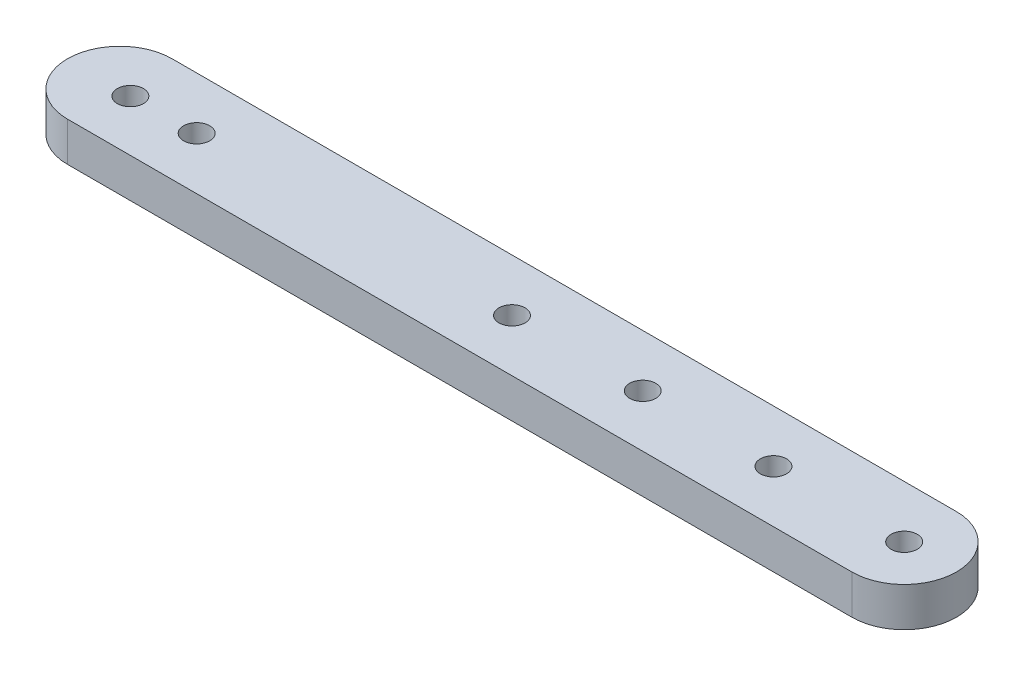
ISO-10303-21;
HEADER;
FILE_DESCRIPTION(('STEP AP214'),'2;1');
FILE_NAME('part.step','',(''),(''),'','','');
FILE_SCHEMA(('AUTOMOTIVE_DESIGN { 1 0 10303 214 1 1 1 1 }'));
ENDSEC;
DATA;
#1=APPLICATION_CONTEXT('core data for automotive mechanical design processes');
#2=APPLICATION_PROTOCOL_DEFINITION('international standard','automotive_design',2000,#1);
#3=PRODUCT_CONTEXT('',#1,'mechanical');
#4=PRODUCT('Part','Part','',(#3));
#5=PRODUCT_RELATED_PRODUCT_CATEGORY('part','',(#4));
#6=PRODUCT_DEFINITION_FORMATION('','',#4);
#7=PRODUCT_DEFINITION_CONTEXT('part definition',#1,'design');
#8=PRODUCT_DEFINITION('design','',#6,#7);
#9=PRODUCT_DEFINITION_SHAPE('','',#8);
#10=(LENGTH_UNIT() NAMED_UNIT(*) SI_UNIT(.MILLI.,.METRE.));
#11=(NAMED_UNIT(*) PLANE_ANGLE_UNIT() SI_UNIT($,.RADIAN.));
#12=(NAMED_UNIT(*) SI_UNIT($,.STERADIAN.) SOLID_ANGLE_UNIT());
#13=UNCERTAINTY_MEASURE_WITH_UNIT(LENGTH_MEASURE(1.E-05),#10,'distance_accuracy_value','');
#14=(GEOMETRIC_REPRESENTATION_CONTEXT(3) GLOBAL_UNCERTAINTY_ASSIGNED_CONTEXT((#13)) GLOBAL_UNIT_ASSIGNED_CONTEXT((#10,
#11,#12)) REPRESENTATION_CONTEXT('',''));
#15=CARTESIAN_POINT('',(0.,0.,0.));
#16=DIRECTION('',(0.,0.,1.));
#17=DIRECTION('',(1.,0.,0.));
#18=AXIS2_PLACEMENT_3D('',#15,#16,#17);
#19=CARTESIAN_POINT('',(60.,6.,0.));
#20=DIRECTION('',(0.,1.,0.));
#21=DIRECTION('',(0.,0.,1.));
#22=AXIS2_PLACEMENT_3D('',#19,#20,#21);
#23=PLANE('',#22);
#24=CARTESIAN_POINT('',(40.,6.,0.));
#25=DIRECTION('',(0.,1.,0.));
#26=DIRECTION('',(0.,0.,1.));
#27=AXIS2_PLACEMENT_3D('',#24,#25,#26);
#28=CIRCLE('',#27,2.);
#29=CARTESIAN_POINT('',(40.,6.,2.));
#30=VERTEX_POINT('',#29);
#31=EDGE_CURVE('E136',#30,#30,#28,.T.);
#32=ORIENTED_EDGE('',*,*,#31,.F.);
#33=EDGE_LOOP('',(#32));
#34=FACE_BOUND('',#33,.T.);
#35=CARTESIAN_POINT('',(20.,6.,0.));
#36=DIRECTION('',(0.,1.,0.));
#37=DIRECTION('',(0.,0.,1.));
#38=AXIS2_PLACEMENT_3D('',#35,#36,#37);
#39=CIRCLE('',#38,2.);
#40=CARTESIAN_POINT('',(20.,6.,2.));
#41=VERTEX_POINT('',#40);
#42=EDGE_CURVE('E124',#41,#41,#39,.T.);
#43=ORIENTED_EDGE('',*,*,#42,.F.);
#44=EDGE_LOOP('',(#43));
#45=FACE_BOUND('',#44,.T.);
#46=CARTESIAN_POINT('',(-58.2457988045519,6.,0.14103811714419));
#47=DIRECTION('',(0.,1.,0.));
#48=DIRECTION('',(0.,0.,1.));
#49=AXIS2_PLACEMENT_3D('',#46,#47,#48);
#50=CIRCLE('',#49,2.);
#51=CARTESIAN_POINT('',(-58.2457988045519,6.,2.14103811714419));
#52=VERTEX_POINT('',#51);
#53=EDGE_CURVE('E103',#52,#52,#50,.T.);
#54=ORIENTED_EDGE('',*,*,#53,.F.);
#55=EDGE_LOOP('',(#54));
#56=FACE_BOUND('',#55,.T.);
#57=CARTESIAN_POINT('',(60.,6.,0.));
#58=DIRECTION('',(0.,1.,0.));
#59=DIRECTION('',(0.,0.,1.));
#60=AXIS2_PLACEMENT_3D('',#57,#58,#59);
#61=CIRCLE('',#60,8.);
#62=CARTESIAN_POINT('',(60.,6.,8.));
#63=VERTEX_POINT('',#62);
#64=CARTESIAN_POINT('',(60.,6.,-8.));
#65=VERTEX_POINT('',#64);
#66=EDGE_CURVE('E88',#63,#65,#61,.T.);
#67=ORIENTED_EDGE('',*,*,#66,.T.);
#68=DIRECTION('',(-1.,0.,0.));
#69=VECTOR('',#68,1.);
#70=CARTESIAN_POINT('',(-60.,6.,-8.));
#71=LINE('',#70,#69);
#72=CARTESIAN_POINT('',(-60.,6.,-8.));
#73=VERTEX_POINT('',#72);
#74=EDGE_CURVE('E83',#65,#73,#71,.T.);
#75=ORIENTED_EDGE('',*,*,#74,.T.);
#76=CARTESIAN_POINT('',(-60.,6.,0.));
#77=DIRECTION('',(0.,1.,0.));
#78=DIRECTION('',(0.,0.,1.));
#79=AXIS2_PLACEMENT_3D('',#76,#77,#78);
#80=CIRCLE('',#79,8.);
#81=CARTESIAN_POINT('',(-60.,6.,8.));
#82=VERTEX_POINT('',#81);
#83=EDGE_CURVE('E86',#73,#82,#80,.T.);
#84=ORIENTED_EDGE('',*,*,#83,.T.);
#85=DIRECTION('',(1.,0.,0.));
#86=VECTOR('',#85,1.);
#87=CARTESIAN_POINT('',(-60.,6.,8.));
#88=LINE('',#87,#86);
#89=EDGE_CURVE('E53',#82,#63,#88,.T.);
#90=ORIENTED_EDGE('',*,*,#89,.T.);
#91=EDGE_LOOP('',(#67,#75,#84,#90));
#92=FACE_BOUND('',#91,.T.);
#93=CARTESIAN_POINT('',(60.,6.,0.));
#94=DIRECTION('',(0.,1.,0.));
#95=DIRECTION('',(0.,0.,1.));
#96=AXIS2_PLACEMENT_3D('',#93,#94,#95);
#97=CIRCLE('',#96,2.);
#98=CARTESIAN_POINT('',(60.,6.,2.));
#99=VERTEX_POINT('',#98);
#100=EDGE_CURVE('E118',#99,#99,#97,.T.);
#101=ORIENTED_EDGE('',*,*,#100,.F.);
#102=EDGE_LOOP('',(#101));
#103=FACE_BOUND('',#102,.T.);
#104=CARTESIAN_POINT('',(-48.2457988045519,6.,0.));
#105=DIRECTION('',(0.,1.,0.));
#106=DIRECTION('',(0.,0.,1.));
#107=AXIS2_PLACEMENT_3D('',#104,#105,#106);
#108=CIRCLE('',#107,2.);
#109=CARTESIAN_POINT('',(-48.2457988045519,6.,2.));
#110=VERTEX_POINT('',#109);
#111=EDGE_CURVE('E130',#110,#110,#108,.T.);
#112=ORIENTED_EDGE('',*,*,#111,.F.);
#113=EDGE_LOOP('',(#112));
#114=FACE_BOUND('',#113,.T.);
#115=CARTESIAN_POINT('',(0.,6.,0.));
#116=DIRECTION('',(0.,1.,0.));
#117=DIRECTION('',(0.,0.,1.));
#118=AXIS2_PLACEMENT_3D('',#115,#116,#117);
#119=CIRCLE('',#118,2.);
#120=CARTESIAN_POINT('',(0.,6.,2.));
#121=VERTEX_POINT('',#120);
#122=EDGE_CURVE('E142',#121,#121,#119,.T.);
#123=ORIENTED_EDGE('',*,*,#122,.F.);
#124=EDGE_LOOP('',(#123));
#125=FACE_BOUND('',#124,.T.);
#126=ADVANCED_FACE('F36',(#34,#45,#56,#92,#103,#114,#125),#23,.T.);
#127=CARTESIAN_POINT('',(60.,0.,0.));
#128=DIRECTION('',(0.,1.,0.));
#129=DIRECTION('',(0.,0.,1.));
#130=AXIS2_PLACEMENT_3D('',#127,#128,#129);
#131=PLANE('',#130);
#132=CARTESIAN_POINT('',(60.,0.,0.));
#133=DIRECTION('',(0.,1.,0.));
#134=DIRECTION('',(0.,0.,1.));
#135=AXIS2_PLACEMENT_3D('',#132,#133,#134);
#136=CIRCLE('',#135,8.);
#137=CARTESIAN_POINT('',(60.,0.,8.));
#138=VERTEX_POINT('',#137);
#139=CARTESIAN_POINT('',(60.,0.,-8.));
#140=VERTEX_POINT('',#139);
#141=EDGE_CURVE('E100',#138,#140,#136,.T.);
#142=ORIENTED_EDGE('',*,*,#141,.F.);
#143=DIRECTION('',(1.,0.,0.));
#144=VECTOR('',#143,1.);
#145=CARTESIAN_POINT('',(-60.,0.,8.));
#146=LINE('',#145,#144);
#147=CARTESIAN_POINT('',(-60.,0.,8.));
#148=VERTEX_POINT('',#147);
#149=EDGE_CURVE('E76',#148,#138,#146,.T.);
#150=ORIENTED_EDGE('',*,*,#149,.F.);
#151=CARTESIAN_POINT('',(-60.,0.,0.));
#152=DIRECTION('',(0.,1.,0.));
#153=DIRECTION('',(0.,0.,1.));
#154=AXIS2_PLACEMENT_3D('',#151,#152,#153);
#155=CIRCLE('',#154,8.);
#156=CARTESIAN_POINT('',(-60.,0.,-8.));
#157=VERTEX_POINT('',#156);
#158=EDGE_CURVE('E70',#157,#148,#155,.T.);
#159=ORIENTED_EDGE('',*,*,#158,.F.);
#160=DIRECTION('',(-1.,0.,0.));
#161=VECTOR('',#160,1.);
#162=CARTESIAN_POINT('',(-60.,0.,-8.));
#163=LINE('',#162,#161);
#164=EDGE_CURVE('E92',#140,#157,#163,.T.);
#165=ORIENTED_EDGE('',*,*,#164,.F.);
#166=EDGE_LOOP('',(#142,#150,#159,#165));
#167=FACE_BOUND('',#166,.T.);
#168=CARTESIAN_POINT('',(-58.2457988045519,0.,0.14103811714419));
#169=DIRECTION('',(0.,1.,0.));
#170=DIRECTION('',(0.,0.,1.));
#171=AXIS2_PLACEMENT_3D('',#168,#169,#170);
#172=CIRCLE('',#171,2.);
#173=CARTESIAN_POINT('',(-58.2457988045519,0.,2.14103811714419));
#174=VERTEX_POINT('',#173);
#175=EDGE_CURVE('E115',#174,#174,#172,.T.);
#176=ORIENTED_EDGE('',*,*,#175,.T.);
#177=EDGE_LOOP('',(#176));
#178=FACE_BOUND('',#177,.T.);
#179=CARTESIAN_POINT('',(60.,0.,0.));
#180=DIRECTION('',(0.,1.,0.));
#181=DIRECTION('',(0.,0.,1.));
#182=AXIS2_PLACEMENT_3D('',#179,#180,#181);
#183=CIRCLE('',#182,2.);
#184=CARTESIAN_POINT('',(60.,0.,2.));
#185=VERTEX_POINT('',#184);
#186=EDGE_CURVE('E121',#185,#185,#183,.T.);
#187=ORIENTED_EDGE('',*,*,#186,.T.);
#188=EDGE_LOOP('',(#187));
#189=FACE_BOUND('',#188,.T.);
#190=CARTESIAN_POINT('',(20.,0.,0.));
#191=DIRECTION('',(0.,1.,0.));
#192=DIRECTION('',(0.,0.,1.));
#193=AXIS2_PLACEMENT_3D('',#190,#191,#192);
#194=CIRCLE('',#193,2.);
#195=CARTESIAN_POINT('',(20.,0.,2.));
#196=VERTEX_POINT('',#195);
#197=EDGE_CURVE('E127',#196,#196,#194,.T.);
#198=ORIENTED_EDGE('',*,*,#197,.T.);
#199=EDGE_LOOP('',(#198));
#200=FACE_BOUND('',#199,.T.);
#201=CARTESIAN_POINT('',(-48.2457988045519,0.,0.));
#202=DIRECTION('',(0.,1.,0.));
#203=DIRECTION('',(0.,0.,1.));
#204=AXIS2_PLACEMENT_3D('',#201,#202,#203);
#205=CIRCLE('',#204,2.);
#206=CARTESIAN_POINT('',(-48.2457988045519,0.,2.));
#207=VERTEX_POINT('',#206);
#208=EDGE_CURVE('E133',#207,#207,#205,.T.);
#209=ORIENTED_EDGE('',*,*,#208,.T.);
#210=EDGE_LOOP('',(#209));
#211=FACE_BOUND('',#210,.T.);
#212=CARTESIAN_POINT('',(40.,0.,0.));
#213=DIRECTION('',(0.,1.,0.));
#214=DIRECTION('',(0.,0.,1.));
#215=AXIS2_PLACEMENT_3D('',#212,#213,#214);
#216=CIRCLE('',#215,2.);
#217=CARTESIAN_POINT('',(40.,0.,2.));
#218=VERTEX_POINT('',#217);
#219=EDGE_CURVE('E139',#218,#218,#216,.T.);
#220=ORIENTED_EDGE('',*,*,#219,.T.);
#221=EDGE_LOOP('',(#220));
#222=FACE_BOUND('',#221,.T.);
#223=CARTESIAN_POINT('',(0.,0.,0.));
#224=DIRECTION('',(0.,1.,0.));
#225=DIRECTION('',(0.,0.,1.));
#226=AXIS2_PLACEMENT_3D('',#223,#224,#225);
#227=CIRCLE('',#226,2.);
#228=CARTESIAN_POINT('',(0.,0.,2.));
#229=VERTEX_POINT('',#228);
#230=EDGE_CURVE('E145',#229,#229,#227,.T.);
#231=ORIENTED_EDGE('',*,*,#230,.T.);
#232=EDGE_LOOP('',(#231));
#233=FACE_BOUND('',#232,.T.);
#234=ADVANCED_FACE('F111',(#167,#178,#189,#200,#211,#222,#233),#131,.F.);
#235=CARTESIAN_POINT('',(60.,6.,0.));
#236=DIRECTION('',(0.,-1.,0.));
#237=DIRECTION('',(0.,0.,-1.));
#238=AXIS2_PLACEMENT_3D('',#235,#236,#237);
#239=CYLINDRICAL_SURFACE('',#238,8.);
#240=ORIENTED_EDGE('',*,*,#141,.T.);
#241=DIRECTION('',(0.,-1.,0.));
#242=VECTOR('',#241,1.);
#243=CARTESIAN_POINT('',(60.,6.,-8.));
#244=LINE('',#243,#242);
#245=EDGE_CURVE('E11',#65,#140,#244,.T.);
#246=ORIENTED_EDGE('',*,*,#245,.F.);
#247=ORIENTED_EDGE('',*,*,#66,.F.);
#248=DIRECTION('',(0.,-1.,0.));
#249=VECTOR('',#248,1.);
#250=CARTESIAN_POINT('',(60.,6.,8.));
#251=LINE('',#250,#249);
#252=EDGE_CURVE('E96',#63,#138,#251,.T.);
#253=ORIENTED_EDGE('',*,*,#252,.T.);
#254=EDGE_LOOP('',(#240,#246,#247,#253));
#255=FACE_BOUND('',#254,.T.);
#256=ADVANCED_FACE('F38',(#255),#239,.T.);
#257=CARTESIAN_POINT('',(-60.,6.,-8.));
#258=DIRECTION('',(0.,0.,1.));
#259=DIRECTION('',(1.,0.,0.));
#260=AXIS2_PLACEMENT_3D('',#257,#258,#259);
#261=PLANE('',#260);
#262=ORIENTED_EDGE('',*,*,#164,.T.);
#263=DIRECTION('',(0.,-1.,0.));
#264=VECTOR('',#263,1.);
#265=CARTESIAN_POINT('',(-60.,6.,-8.));
#266=LINE('',#265,#264);
#267=EDGE_CURVE('E45',#73,#157,#266,.T.);
#268=ORIENTED_EDGE('',*,*,#267,.F.);
#269=ORIENTED_EDGE('',*,*,#74,.F.);
#270=ORIENTED_EDGE('',*,*,#245,.T.);
#271=EDGE_LOOP('',(#262,#268,#269,#270));
#272=FACE_BOUND('',#271,.T.);
#273=ADVANCED_FACE('F91',(#272),#261,.F.);
#274=CARTESIAN_POINT('',(-60.,6.,0.));
#275=DIRECTION('',(0.,-1.,0.));
#276=DIRECTION('',(0.,0.,-1.));
#277=AXIS2_PLACEMENT_3D('',#274,#275,#276);
#278=CYLINDRICAL_SURFACE('',#277,8.);
#279=ORIENTED_EDGE('',*,*,#158,.T.);
#280=DIRECTION('',(0.,-1.,0.));
#281=VECTOR('',#280,1.);
#282=CARTESIAN_POINT('',(-60.,6.,8.));
#283=LINE('',#282,#281);
#284=EDGE_CURVE('E93',#82,#148,#283,.T.);
#285=ORIENTED_EDGE('',*,*,#284,.F.);
#286=ORIENTED_EDGE('',*,*,#83,.F.);
#287=ORIENTED_EDGE('',*,*,#267,.T.);
#288=EDGE_LOOP('',(#279,#285,#286,#287));
#289=FACE_BOUND('',#288,.T.);
#290=ADVANCED_FACE('F94',(#289),#278,.T.);
#291=CARTESIAN_POINT('',(-60.,6.,8.));
#292=DIRECTION('',(0.,0.,-1.));
#293=DIRECTION('',(-1.,0.,0.));
#294=AXIS2_PLACEMENT_3D('',#291,#292,#293);
#295=PLANE('',#294);
#296=ORIENTED_EDGE('',*,*,#149,.T.);
#297=ORIENTED_EDGE('',*,*,#252,.F.);
#298=ORIENTED_EDGE('',*,*,#89,.F.);
#299=ORIENTED_EDGE('',*,*,#284,.T.);
#300=EDGE_LOOP('',(#296,#297,#298,#299));
#301=FACE_BOUND('',#300,.T.);
#302=ADVANCED_FACE('F108',(#301),#295,.F.);
#303=CARTESIAN_POINT('',(-58.2457988045519,6.,0.14103811714419));
#304=DIRECTION('',(0.,-1.,0.));
#305=DIRECTION('',(0.,0.,-1.));
#306=AXIS2_PLACEMENT_3D('',#303,#304,#305);
#307=CYLINDRICAL_SURFACE('',#306,2.);
#308=ORIENTED_EDGE('',*,*,#53,.T.);
#309=EDGE_LOOP('',(#308));
#310=FACE_BOUND('',#309,.T.);
#311=ORIENTED_EDGE('',*,*,#175,.F.);
#312=EDGE_LOOP('',(#311));
#313=FACE_BOUND('',#312,.T.);
#314=ADVANCED_FACE('F164',(#310,#313),#307,.F.);
#315=CARTESIAN_POINT('',(60.,6.,0.));
#316=DIRECTION('',(0.,-1.,0.));
#317=DIRECTION('',(0.,0.,-1.));
#318=AXIS2_PLACEMENT_3D('',#315,#316,#317);
#319=CYLINDRICAL_SURFACE('',#318,2.);
#320=ORIENTED_EDGE('',*,*,#100,.T.);
#321=EDGE_LOOP('',(#320));
#322=FACE_BOUND('',#321,.T.);
#323=ORIENTED_EDGE('',*,*,#186,.F.);
#324=EDGE_LOOP('',(#323));
#325=FACE_BOUND('',#324,.T.);
#326=ADVANCED_FACE('F210',(#322,#325),#319,.F.);
#327=CARTESIAN_POINT('',(20.,6.,0.));
#328=DIRECTION('',(0.,-1.,0.));
#329=DIRECTION('',(0.,0.,-1.));
#330=AXIS2_PLACEMENT_3D('',#327,#328,#329);
#331=CYLINDRICAL_SURFACE('',#330,2.);
#332=ORIENTED_EDGE('',*,*,#42,.T.);
#333=EDGE_LOOP('',(#332));
#334=FACE_BOUND('',#333,.T.);
#335=ORIENTED_EDGE('',*,*,#197,.F.);
#336=EDGE_LOOP('',(#335));
#337=FACE_BOUND('',#336,.T.);
#338=ADVANCED_FACE('F218',(#334,#337),#331,.F.);
#339=CARTESIAN_POINT('',(-48.2457988045519,6.,0.));
#340=DIRECTION('',(0.,-1.,0.));
#341=DIRECTION('',(0.,0.,-1.));
#342=AXIS2_PLACEMENT_3D('',#339,#340,#341);
#343=CYLINDRICAL_SURFACE('',#342,2.);
#344=ORIENTED_EDGE('',*,*,#111,.T.);
#345=EDGE_LOOP('',(#344));
#346=FACE_BOUND('',#345,.T.);
#347=ORIENTED_EDGE('',*,*,#208,.F.);
#348=EDGE_LOOP('',(#347));
#349=FACE_BOUND('',#348,.T.);
#350=ADVANCED_FACE('F226',(#346,#349),#343,.F.);
#351=CARTESIAN_POINT('',(40.,6.,0.));
#352=DIRECTION('',(0.,-1.,0.));
#353=DIRECTION('',(0.,0.,-1.));
#354=AXIS2_PLACEMENT_3D('',#351,#352,#353);
#355=CYLINDRICAL_SURFACE('',#354,2.);
#356=ORIENTED_EDGE('',*,*,#31,.T.);
#357=EDGE_LOOP('',(#356));
#358=FACE_BOUND('',#357,.T.);
#359=ORIENTED_EDGE('',*,*,#219,.F.);
#360=EDGE_LOOP('',(#359));
#361=FACE_BOUND('',#360,.T.);
#362=ADVANCED_FACE('F235',(#358,#361),#355,.F.);
#363=CARTESIAN_POINT('',(0.,6.,0.));
#364=DIRECTION('',(0.,-1.,0.));
#365=DIRECTION('',(0.,0.,-1.));
#366=AXIS2_PLACEMENT_3D('',#363,#364,#365);
#367=CYLINDRICAL_SURFACE('',#366,2.);
#368=ORIENTED_EDGE('',*,*,#122,.T.);
#369=EDGE_LOOP('',(#368));
#370=FACE_BOUND('',#369,.T.);
#371=ORIENTED_EDGE('',*,*,#230,.F.);
#372=EDGE_LOOP('',(#371));
#373=FACE_BOUND('',#372,.T.);
#374=ADVANCED_FACE('F151',(#370,#373),#367,.F.);
#375=CLOSED_SHELL('',(#126,#234,#256,#273,#290,#302,#314,#326,#338,#350,#362,#374));
#376=MANIFOLD_SOLID_BREP('B2',#375);
#377=ADVANCED_BREP_SHAPE_REPRESENTATION('',(#18,#376),#14);
#378=SHAPE_DEFINITION_REPRESENTATION(#9,#377);
ENDSEC;
END-ISO-10303-21;
